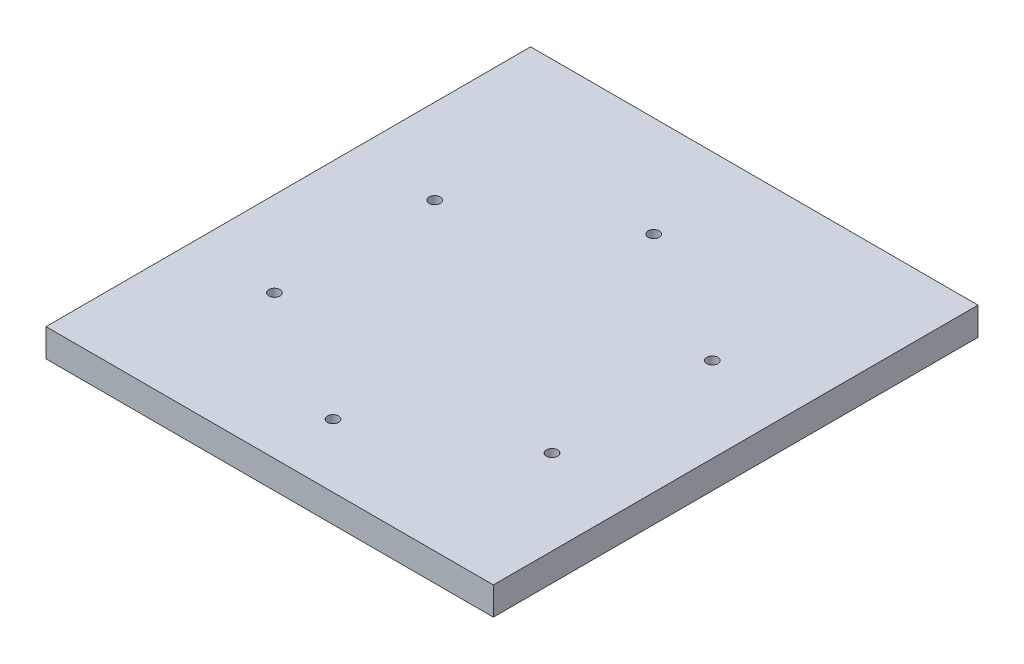
ISO-10303-21;
HEADER;
FILE_DESCRIPTION(('STEP AP214'),'2;1');
FILE_NAME('part.step','',(''),(''),'','','');
FILE_SCHEMA(('AUTOMOTIVE_DESIGN { 1 0 10303 214 1 1 1 1 }'));
ENDSEC;
DATA;
#1=APPLICATION_CONTEXT('core data for automotive mechanical design processes');
#2=APPLICATION_PROTOCOL_DEFINITION('international standard','automotive_design',2000,#1);
#3=PRODUCT_CONTEXT('',#1,'mechanical');
#4=PRODUCT('Part','Part','',(#3));
#5=PRODUCT_RELATED_PRODUCT_CATEGORY('part','',(#4));
#6=PRODUCT_DEFINITION_FORMATION('','',#4);
#7=PRODUCT_DEFINITION_CONTEXT('part definition',#1,'design');
#8=PRODUCT_DEFINITION('design','',#6,#7);
#9=PRODUCT_DEFINITION_SHAPE('','',#8);
#10=(LENGTH_UNIT() NAMED_UNIT(*) SI_UNIT(.MILLI.,.METRE.));
#11=(NAMED_UNIT(*) PLANE_ANGLE_UNIT() SI_UNIT($,.RADIAN.));
#12=(NAMED_UNIT(*) SI_UNIT($,.STERADIAN.) SOLID_ANGLE_UNIT());
#13=UNCERTAINTY_MEASURE_WITH_UNIT(LENGTH_MEASURE(1.E-05),#10,'distance_accuracy_value','');
#14=(GEOMETRIC_REPRESENTATION_CONTEXT(3) GLOBAL_UNCERTAINTY_ASSIGNED_CONTEXT((#13)) GLOBAL_UNIT_ASSIGNED_CONTEXT((#10,
#11,#12)) REPRESENTATION_CONTEXT('',''));
#15=CARTESIAN_POINT('',(0.,0.,0.));
#16=DIRECTION('',(0.,0.,1.));
#17=DIRECTION('',(1.,0.,0.));
#18=AXIS2_PLACEMENT_3D('',#15,#16,#17);
#19=CARTESIAN_POINT('',(0.,15.,0.));
#20=DIRECTION('',(0.,1.,0.));
#21=DIRECTION('',(0.,0.,1.));
#22=AXIS2_PLACEMENT_3D('',#19,#20,#21);
#23=PLANE('',#22);
#24=CARTESIAN_POINT('',(74.47818473,15.,-53.));
#25=DIRECTION('',(0.,1.,0.));
#26=DIRECTION('',(0.,0.,1.));
#27=AXIS2_PLACEMENT_3D('',#24,#25,#26);
#28=CIRCLE('',#27,3.00000000000001);
#29=CARTESIAN_POINT('',(74.47818473,15.,-50.));
#30=VERTEX_POINT('',#29);
#31=EDGE_CURVE('E118',#30,#30,#28,.T.);
#32=ORIENTED_EDGE('',*,*,#31,.F.);
#33=EDGE_LOOP('',(#32));
#34=FACE_BOUND('',#33,.T.);
#35=CARTESIAN_POINT('',(-74.47818473,15.,-52.9999999999999));
#36=DIRECTION('',(0.,1.,0.));
#37=DIRECTION('',(0.,0.,1.));
#38=AXIS2_PLACEMENT_3D('',#35,#36,#37);
#39=CIRCLE('',#38,3.00000000000001);
#40=CARTESIAN_POINT('',(-74.47818473,15.,-49.9999999999998));
#41=VERTEX_POINT('',#40);
#42=EDGE_CURVE('E134',#41,#41,#39,.T.);
#43=ORIENTED_EDGE('',*,*,#42,.F.);
#44=EDGE_LOOP('',(#43));
#45=FACE_BOUND('',#44,.T.);
#46=CARTESIAN_POINT('',(0.,15.,-96.));
#47=DIRECTION('',(0.,1.,0.));
#48=DIRECTION('',(0.,0.,1.));
#49=AXIS2_PLACEMENT_3D('',#46,#47,#48);
#50=CIRCLE('',#49,3.);
#51=CARTESIAN_POINT('',(0.,15.,-93.));
#52=VERTEX_POINT('',#51);
#53=EDGE_CURVE('E150',#52,#52,#50,.T.);
#54=ORIENTED_EDGE('',*,*,#53,.F.);
#55=EDGE_LOOP('',(#54));
#56=FACE_BOUND('',#55,.T.);
#57=DIRECTION('',(0.,0.,-1.));
#58=VECTOR('',#57,1.);
#59=CARTESIAN_POINT('',(120.,15.,-110.));
#60=LINE('',#59,#58);
#61=CARTESIAN_POINT('',(120.,15.,110.));
#62=VERTEX_POINT('',#61);
#63=CARTESIAN_POINT('',(120.,15.,-150.));
#64=VERTEX_POINT('',#63);
#65=EDGE_CURVE('E88',#62,#64,#60,.T.);
#66=ORIENTED_EDGE('',*,*,#65,.T.);
#67=DIRECTION('',(-1.,0.,0.));
#68=VECTOR('',#67,1.);
#69=CARTESIAN_POINT('',(-120.,15.,-150.));
#70=LINE('',#69,#68);
#71=CARTESIAN_POINT('',(-120.,15.,-150.));
#72=VERTEX_POINT('',#71);
#73=EDGE_CURVE('E94',#64,#72,#70,.T.);
#74=ORIENTED_EDGE('',*,*,#73,.T.);
#75=DIRECTION('',(0.,0.,1.));
#76=VECTOR('',#75,1.);
#77=CARTESIAN_POINT('',(-120.,15.,-110.));
#78=LINE('',#77,#76);
#79=CARTESIAN_POINT('',(-120.,15.,110.));
#80=VERTEX_POINT('',#79);
#81=EDGE_CURVE('E81',#72,#80,#78,.T.);
#82=ORIENTED_EDGE('',*,*,#81,.T.);
#83=DIRECTION('',(1.,0.,0.));
#84=VECTOR('',#83,1.);
#85=CARTESIAN_POINT('',(-120.,15.,110.));
#86=LINE('',#85,#84);
#87=EDGE_CURVE('E57',#80,#62,#86,.T.);
#88=ORIENTED_EDGE('',*,*,#87,.T.);
#89=EDGE_LOOP('',(#66,#74,#82,#88));
#90=FACE_BOUND('',#89,.T.);
#91=CARTESIAN_POINT('',(0.,15.,76.));
#92=DIRECTION('',(0.,1.,0.));
#93=DIRECTION('',(0.,0.,1.));
#94=AXIS2_PLACEMENT_3D('',#91,#92,#93);
#95=CIRCLE('',#94,3.);
#96=CARTESIAN_POINT('',(0.,15.,79.));
#97=VERTEX_POINT('',#96);
#98=EDGE_CURVE('E142',#97,#97,#95,.T.);
#99=ORIENTED_EDGE('',*,*,#98,.F.);
#100=EDGE_LOOP('',(#99));
#101=FACE_BOUND('',#100,.T.);
#102=CARTESIAN_POINT('',(-74.47818473,15.,33.0000000000001));
#103=DIRECTION('',(0.,1.,0.));
#104=DIRECTION('',(0.,0.,1.));
#105=AXIS2_PLACEMENT_3D('',#102,#103,#104);
#106=CIRCLE('',#105,3.00000000000001);
#107=CARTESIAN_POINT('',(-74.47818473,15.,36.0000000000001));
#108=VERTEX_POINT('',#107);
#109=EDGE_CURVE('E126',#108,#108,#106,.T.);
#110=ORIENTED_EDGE('',*,*,#109,.F.);
#111=EDGE_LOOP('',(#110));
#112=FACE_BOUND('',#111,.T.);
#113=CARTESIAN_POINT('',(74.47818473,15.,33.));
#114=DIRECTION('',(0.,1.,0.));
#115=DIRECTION('',(0.,0.,1.));
#116=AXIS2_PLACEMENT_3D('',#113,#114,#115);
#117=CIRCLE('',#116,2.99999999999999);
#118=CARTESIAN_POINT('',(74.47818473,15.,36.));
#119=VERTEX_POINT('',#118);
#120=EDGE_CURVE('E110',#119,#119,#117,.T.);
#121=ORIENTED_EDGE('',*,*,#120,.F.);
#122=EDGE_LOOP('',(#121));
#123=FACE_BOUND('',#122,.T.);
#124=ADVANCED_FACE('F39',(#34,#45,#56,#90,#101,#112,#123),#23,.T.);
#125=CARTESIAN_POINT('',(0.,0.,0.));
#126=DIRECTION('',(0.,1.,0.));
#127=DIRECTION('',(0.,0.,1.));
#128=AXIS2_PLACEMENT_3D('',#125,#126,#127);
#129=PLANE('',#128);
#130=DIRECTION('',(0.,0.,-1.));
#131=VECTOR('',#130,1.);
#132=CARTESIAN_POINT('',(120.,0.,-110.));
#133=LINE('',#132,#131);
#134=CARTESIAN_POINT('',(120.,0.,110.));
#135=VERTEX_POINT('',#134);
#136=CARTESIAN_POINT('',(120.,0.,-150.));
#137=VERTEX_POINT('',#136);
#138=EDGE_CURVE('E154',#135,#137,#133,.T.);
#139=ORIENTED_EDGE('',*,*,#138,.F.);
#140=DIRECTION('',(1.,0.,0.));
#141=VECTOR('',#140,1.);
#142=CARTESIAN_POINT('',(-120.,0.,110.));
#143=LINE('',#142,#141);
#144=CARTESIAN_POINT('',(-120.,0.,110.));
#145=VERTEX_POINT('',#144);
#146=EDGE_CURVE('E159',#145,#135,#143,.T.);
#147=ORIENTED_EDGE('',*,*,#146,.F.);
#148=DIRECTION('',(0.,0.,1.));
#149=VECTOR('',#148,1.);
#150=CARTESIAN_POINT('',(-120.,0.,-110.));
#151=LINE('',#150,#149);
#152=CARTESIAN_POINT('',(-120.,0.,-150.));
#153=VERTEX_POINT('',#152);
#154=EDGE_CURVE('E68',#153,#145,#151,.T.);
#155=ORIENTED_EDGE('',*,*,#154,.F.);
#156=DIRECTION('',(-1.,0.,0.));
#157=VECTOR('',#156,1.);
#158=CARTESIAN_POINT('',(-120.,0.,-150.));
#159=LINE('',#158,#157);
#160=EDGE_CURVE('E95',#137,#153,#159,.T.);
#161=ORIENTED_EDGE('',*,*,#160,.F.);
#162=EDGE_LOOP('',(#139,#147,#155,#161));
#163=FACE_BOUND('',#162,.T.);
#164=CARTESIAN_POINT('',(0.,0.,-96.));
#165=DIRECTION('',(0.,1.,0.));
#166=DIRECTION('',(0.,0.,1.));
#167=AXIS2_PLACEMENT_3D('',#164,#165,#166);
#168=CIRCLE('',#167,3.);
#169=CARTESIAN_POINT('',(0.,0.,-93.));
#170=VERTEX_POINT('',#169);
#171=EDGE_CURVE('E146',#170,#170,#168,.T.);
#172=ORIENTED_EDGE('',*,*,#171,.T.);
#173=EDGE_LOOP('',(#172));
#174=FACE_BOUND('',#173,.T.);
#175=CARTESIAN_POINT('',(0.,0.,76.));
#176=DIRECTION('',(0.,1.,0.));
#177=DIRECTION('',(0.,0.,1.));
#178=AXIS2_PLACEMENT_3D('',#175,#176,#177);
#179=CIRCLE('',#178,3.);
#180=CARTESIAN_POINT('',(0.,0.,79.));
#181=VERTEX_POINT('',#180);
#182=EDGE_CURVE('E138',#181,#181,#179,.T.);
#183=ORIENTED_EDGE('',*,*,#182,.T.);
#184=EDGE_LOOP('',(#183));
#185=FACE_BOUND('',#184,.T.);
#186=CARTESIAN_POINT('',(-74.47818473,0.,-52.9999999999999));
#187=DIRECTION('',(0.,1.,0.));
#188=DIRECTION('',(0.,0.,1.));
#189=AXIS2_PLACEMENT_3D('',#186,#187,#188);
#190=CIRCLE('',#189,3.00000000000001);
#191=CARTESIAN_POINT('',(-74.47818473,0.,-49.9999999999998));
#192=VERTEX_POINT('',#191);
#193=EDGE_CURVE('E130',#192,#192,#190,.T.);
#194=ORIENTED_EDGE('',*,*,#193,.T.);
#195=EDGE_LOOP('',(#194));
#196=FACE_BOUND('',#195,.T.);
#197=CARTESIAN_POINT('',(-74.47818473,0.,33.0000000000001));
#198=DIRECTION('',(0.,1.,0.));
#199=DIRECTION('',(0.,0.,1.));
#200=AXIS2_PLACEMENT_3D('',#197,#198,#199);
#201=CIRCLE('',#200,3.00000000000001);
#202=CARTESIAN_POINT('',(-74.47818473,0.,36.0000000000001));
#203=VERTEX_POINT('',#202);
#204=EDGE_CURVE('E122',#203,#203,#201,.T.);
#205=ORIENTED_EDGE('',*,*,#204,.T.);
#206=EDGE_LOOP('',(#205));
#207=FACE_BOUND('',#206,.T.);
#208=CARTESIAN_POINT('',(74.47818473,0.,-53.));
#209=DIRECTION('',(0.,1.,0.));
#210=DIRECTION('',(0.,0.,1.));
#211=AXIS2_PLACEMENT_3D('',#208,#209,#210);
#212=CIRCLE('',#211,3.00000000000001);
#213=CARTESIAN_POINT('',(74.47818473,0.,-50.));
#214=VERTEX_POINT('',#213);
#215=EDGE_CURVE('E114',#214,#214,#212,.T.);
#216=ORIENTED_EDGE('',*,*,#215,.T.);
#217=EDGE_LOOP('',(#216));
#218=FACE_BOUND('',#217,.T.);
#219=CARTESIAN_POINT('',(74.47818473,0.,33.));
#220=DIRECTION('',(0.,1.,0.));
#221=DIRECTION('',(0.,0.,1.));
#222=AXIS2_PLACEMENT_3D('',#219,#220,#221);
#223=CIRCLE('',#222,2.99999999999999);
#224=CARTESIAN_POINT('',(74.47818473,0.,36.));
#225=VERTEX_POINT('',#224);
#226=EDGE_CURVE('E97',#225,#225,#223,.T.);
#227=ORIENTED_EDGE('',*,*,#226,.T.);
#228=EDGE_LOOP('',(#227));
#229=FACE_BOUND('',#228,.T.);
#230=ADVANCED_FACE('F173',(#163,#174,#185,#196,#207,#218,#229),#129,.F.);
#231=CARTESIAN_POINT('',(120.,15.,-110.));
#232=DIRECTION('',(-1.,0.,0.));
#233=DIRECTION('',(0.,0.,1.));
#234=AXIS2_PLACEMENT_3D('',#231,#232,#233);
#235=PLANE('',#234);
#236=ORIENTED_EDGE('',*,*,#138,.T.);
#237=DIRECTION('',(0.,1.,0.));
#238=VECTOR('',#237,1.);
#239=CARTESIAN_POINT('',(120.,0.,-150.));
#240=LINE('',#239,#238);
#241=EDGE_CURVE('E98',#137,#64,#240,.T.);
#242=ORIENTED_EDGE('',*,*,#241,.T.);
#243=ORIENTED_EDGE('',*,*,#65,.F.);
#244=DIRECTION('',(0.,-1.,0.));
#245=VECTOR('',#244,1.);
#246=CARTESIAN_POINT('',(120.,15.,110.));
#247=LINE('',#246,#245);
#248=EDGE_CURVE('E49',#62,#135,#247,.T.);
#249=ORIENTED_EDGE('',*,*,#248,.T.);
#250=EDGE_LOOP('',(#236,#242,#243,#249));
#251=FACE_BOUND('',#250,.T.);
#252=ADVANCED_FACE('F41',(#251),#235,.F.);
#253=CARTESIAN_POINT('',(-120.,15.,-110.));
#254=DIRECTION('',(1.,0.,0.));
#255=DIRECTION('',(0.,0.,-1.));
#256=AXIS2_PLACEMENT_3D('',#253,#254,#255);
#257=PLANE('',#256);
#258=ORIENTED_EDGE('',*,*,#154,.T.);
#259=DIRECTION('',(0.,-1.,0.));
#260=VECTOR('',#259,1.);
#261=CARTESIAN_POINT('',(-120.,15.,110.));
#262=LINE('',#261,#260);
#263=EDGE_CURVE('E11',#80,#145,#262,.T.);
#264=ORIENTED_EDGE('',*,*,#263,.F.);
#265=ORIENTED_EDGE('',*,*,#81,.F.);
#266=DIRECTION('',(0.,1.,0.));
#267=VECTOR('',#266,1.);
#268=CARTESIAN_POINT('',(-120.,0.,-150.));
#269=LINE('',#268,#267);
#270=EDGE_CURVE('E84',#153,#72,#269,.T.);
#271=ORIENTED_EDGE('',*,*,#270,.F.);
#272=EDGE_LOOP('',(#258,#264,#265,#271));
#273=FACE_BOUND('',#272,.T.);
#274=ADVANCED_FACE('F83',(#273),#257,.F.);
#275=CARTESIAN_POINT('',(-120.,15.,110.));
#276=DIRECTION('',(0.,0.,-1.));
#277=DIRECTION('',(-1.,0.,0.));
#278=AXIS2_PLACEMENT_3D('',#275,#276,#277);
#279=PLANE('',#278);
#280=ORIENTED_EDGE('',*,*,#146,.T.);
#281=ORIENTED_EDGE('',*,*,#248,.F.);
#282=ORIENTED_EDGE('',*,*,#87,.F.);
#283=ORIENTED_EDGE('',*,*,#263,.T.);
#284=EDGE_LOOP('',(#280,#281,#282,#283));
#285=FACE_BOUND('',#284,.T.);
#286=ADVANCED_FACE('F175',(#285),#279,.F.);
#287=CARTESIAN_POINT('',(0.,15.,-96.));
#288=DIRECTION('',(0.,-1.,0.));
#289=DIRECTION('',(0.,0.,-1.));
#290=AXIS2_PLACEMENT_3D('',#287,#288,#289);
#291=CYLINDRICAL_SURFACE('',#290,3.);
#292=ORIENTED_EDGE('',*,*,#53,.T.);
#293=EDGE_LOOP('',(#292));
#294=FACE_BOUND('',#293,.T.);
#295=ORIENTED_EDGE('',*,*,#171,.F.);
#296=EDGE_LOOP('',(#295));
#297=FACE_BOUND('',#296,.T.);
#298=ADVANCED_FACE('F177',(#294,#297),#291,.F.);
#299=CARTESIAN_POINT('',(0.,15.,76.));
#300=DIRECTION('',(0.,-1.,0.));
#301=DIRECTION('',(0.,0.,-1.));
#302=AXIS2_PLACEMENT_3D('',#299,#300,#301);
#303=CYLINDRICAL_SURFACE('',#302,3.);
#304=ORIENTED_EDGE('',*,*,#98,.T.);
#305=EDGE_LOOP('',(#304));
#306=FACE_BOUND('',#305,.T.);
#307=ORIENTED_EDGE('',*,*,#182,.F.);
#308=EDGE_LOOP('',(#307));
#309=FACE_BOUND('',#308,.T.);
#310=ADVANCED_FACE('F183',(#306,#309),#303,.F.);
#311=CARTESIAN_POINT('',(-74.47818473,15.,-52.9999999999999));
#312=DIRECTION('',(0.,-1.,0.));
#313=DIRECTION('',(0.,0.,-1.));
#314=AXIS2_PLACEMENT_3D('',#311,#312,#313);
#315=CYLINDRICAL_SURFACE('',#314,3.00000000000001);
#316=ORIENTED_EDGE('',*,*,#42,.T.);
#317=EDGE_LOOP('',(#316));
#318=FACE_BOUND('',#317,.T.);
#319=ORIENTED_EDGE('',*,*,#193,.F.);
#320=EDGE_LOOP('',(#319));
#321=FACE_BOUND('',#320,.T.);
#322=ADVANCED_FACE('F198',(#318,#321),#315,.F.);
#323=CARTESIAN_POINT('',(-74.47818473,15.,33.0000000000001));
#324=DIRECTION('',(0.,-1.,0.));
#325=DIRECTION('',(0.,0.,-1.));
#326=AXIS2_PLACEMENT_3D('',#323,#324,#325);
#327=CYLINDRICAL_SURFACE('',#326,3.00000000000001);
#328=ORIENTED_EDGE('',*,*,#109,.T.);
#329=EDGE_LOOP('',(#328));
#330=FACE_BOUND('',#329,.T.);
#331=ORIENTED_EDGE('',*,*,#204,.F.);
#332=EDGE_LOOP('',(#331));
#333=FACE_BOUND('',#332,.T.);
#334=ADVANCED_FACE('F202',(#330,#333),#327,.F.);
#335=CARTESIAN_POINT('',(74.47818473,15.,-53.));
#336=DIRECTION('',(0.,-1.,0.));
#337=DIRECTION('',(0.,0.,-1.));
#338=AXIS2_PLACEMENT_3D('',#335,#336,#337);
#339=CYLINDRICAL_SURFACE('',#338,3.00000000000001);
#340=ORIENTED_EDGE('',*,*,#31,.T.);
#341=EDGE_LOOP('',(#340));
#342=FACE_BOUND('',#341,.T.);
#343=ORIENTED_EDGE('',*,*,#215,.F.);
#344=EDGE_LOOP('',(#343));
#345=FACE_BOUND('',#344,.T.);
#346=ADVANCED_FACE('F206',(#342,#345),#339,.F.);
#347=CARTESIAN_POINT('',(74.47818473,15.,33.));
#348=DIRECTION('',(0.,-1.,0.));
#349=DIRECTION('',(0.,0.,-1.));
#350=AXIS2_PLACEMENT_3D('',#347,#348,#349);
#351=CYLINDRICAL_SURFACE('',#350,2.99999999999999);
#352=ORIENTED_EDGE('',*,*,#120,.T.);
#353=EDGE_LOOP('',(#352));
#354=FACE_BOUND('',#353,.T.);
#355=ORIENTED_EDGE('',*,*,#226,.F.);
#356=EDGE_LOOP('',(#355));
#357=FACE_BOUND('',#356,.T.);
#358=ADVANCED_FACE('F210',(#354,#357),#351,.F.);
#359=CARTESIAN_POINT('',(-120.,0.,-150.));
#360=DIRECTION('',(0.,0.,-1.));
#361=DIRECTION('',(-1.,0.,0.));
#362=AXIS2_PLACEMENT_3D('',#359,#360,#361);
#363=PLANE('',#362);
#364=ORIENTED_EDGE('',*,*,#73,.F.);
#365=ORIENTED_EDGE('',*,*,#241,.F.);
#366=ORIENTED_EDGE('',*,*,#160,.T.);
#367=ORIENTED_EDGE('',*,*,#270,.T.);
#368=EDGE_LOOP('',(#364,#365,#366,#367));
#369=FACE_BOUND('',#368,.T.);
#370=ADVANCED_FACE('F92',(#369),#363,.T.);
#371=CLOSED_SHELL('',(#124,#230,#252,#274,#286,#298,#310,#322,#334,#346,#358,#370));
#372=MANIFOLD_SOLID_BREP('B2',#371);
#373=ADVANCED_BREP_SHAPE_REPRESENTATION('',(#18,#372),#14);
#374=SHAPE_DEFINITION_REPRESENTATION(#9,#373);
ENDSEC;
END-ISO-10303-21;
